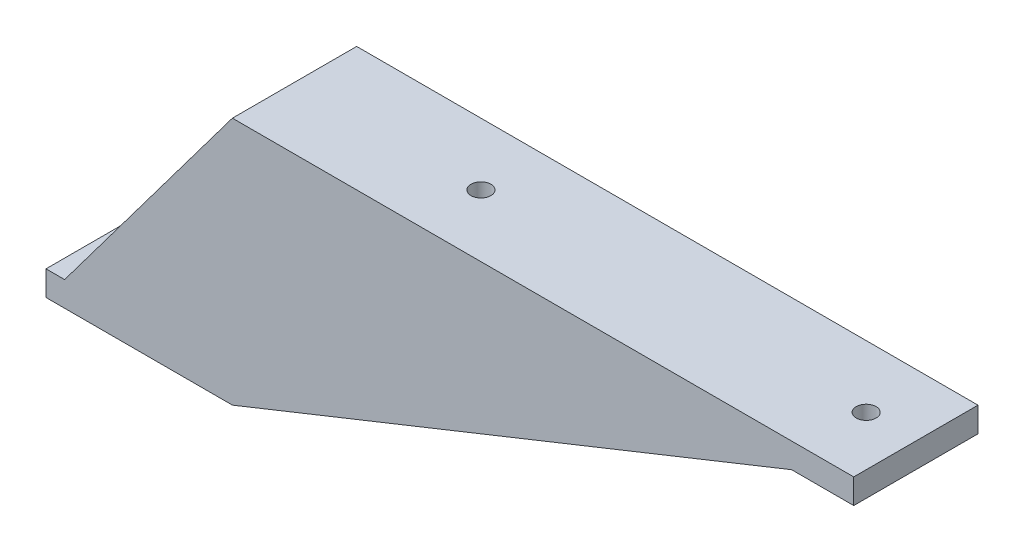
ISO-10303-21;
HEADER;
FILE_DESCRIPTION(('STEP AP214'),'2;1');
FILE_NAME('part.step','',(''),(''),'','','');
FILE_SCHEMA(('AUTOMOTIVE_DESIGN { 1 0 10303 214 1 1 1 1 }'));
ENDSEC;
DATA;
#1=APPLICATION_CONTEXT('core data for automotive mechanical design processes');
#2=APPLICATION_PROTOCOL_DEFINITION('international standard','automotive_design',2000,#1);
#3=PRODUCT_CONTEXT('',#1,'mechanical');
#4=PRODUCT('Part','Part','',(#3));
#5=PRODUCT_RELATED_PRODUCT_CATEGORY('part','',(#4));
#6=PRODUCT_DEFINITION_FORMATION('','',#4);
#7=PRODUCT_DEFINITION_CONTEXT('part definition',#1,'design');
#8=PRODUCT_DEFINITION('design','',#6,#7);
#9=PRODUCT_DEFINITION_SHAPE('','',#8);
#10=(LENGTH_UNIT() NAMED_UNIT(*) SI_UNIT(.MILLI.,.METRE.));
#11=(NAMED_UNIT(*) PLANE_ANGLE_UNIT() SI_UNIT($,.RADIAN.));
#12=(NAMED_UNIT(*) SI_UNIT($,.STERADIAN.) SOLID_ANGLE_UNIT());
#13=UNCERTAINTY_MEASURE_WITH_UNIT(LENGTH_MEASURE(1.E-05),#10,'distance_accuracy_value','');
#14=(GEOMETRIC_REPRESENTATION_CONTEXT(3) GLOBAL_UNCERTAINTY_ASSIGNED_CONTEXT((#13)) GLOBAL_UNIT_ASSIGNED_CONTEXT((#10,
#11,#12)) REPRESENTATION_CONTEXT('',''));
#15=CARTESIAN_POINT('',(0.,0.,0.));
#16=DIRECTION('',(0.,0.,1.));
#17=DIRECTION('',(1.,0.,0.));
#18=AXIS2_PLACEMENT_3D('',#15,#16,#17);
#19=CARTESIAN_POINT('',(0.,0.,0.));
#20=DIRECTION('',(0.,0.,-1.));
#21=DIRECTION('',(-1.,0.,0.));
#22=AXIS2_PLACEMENT_3D('',#19,#20,#21);
#23=PLANE('',#22);
#24=DIRECTION('',(0.928476690885259,0.371390676354104,0.));
#25=VECTOR('',#24,1.);
#26=CARTESIAN_POINT('',(50.,20.,0.));
#27=LINE('',#26,#25);
#28=CARTESIAN_POINT('',(1.,0.399999999999999,0.));
#29=VERTEX_POINT('',#28);
#30=CARTESIAN_POINT('',(45.,18.,0.));
#31=VERTEX_POINT('',#30);
#32=EDGE_CURVE('E207',#29,#31,#27,.T.);
#33=ORIENTED_EDGE('',*,*,#32,.F.);
#34=DIRECTION('',(0.,-1.,0.));
#35=VECTOR('',#34,1.);
#36=CARTESIAN_POINT('',(1.,18.,0.));
#37=LINE('',#36,#35);
#38=CARTESIAN_POINT('',(1.,18.,0.));
#39=VERTEX_POINT('',#38);
#40=EDGE_CURVE('E226',#39,#29,#37,.T.);
#41=ORIENTED_EDGE('',*,*,#40,.F.);
#42=DIRECTION('',(1.,0.,0.));
#43=VECTOR('',#42,1.);
#44=CARTESIAN_POINT('',(0.,18.,0.));
#45=LINE('',#44,#43);
#46=EDGE_CURVE('E43',#39,#31,#45,.T.);
#47=ORIENTED_EDGE('',*,*,#46,.T.);
#48=EDGE_LOOP('',(#33,#41,#47));
#49=FACE_BOUND('',#48,.T.);
#50=ADVANCED_FACE('F35',(#49),#23,.T.);
#51=DIRECTION('',(-0.6,-0.8,0.));
#52=VECTOR('',#51,1.);
#53=CARTESIAN_POINT('',(-15.,0.,0.));
#54=LINE('',#53,#52);
#55=CARTESIAN_POINT('',(-0.999999999999991,18.6666666666667,0.));
#56=VERTEX_POINT('',#55);
#57=CARTESIAN_POINT('',(-13.5,2.,0.));
#58=VERTEX_POINT('',#57);
#59=EDGE_CURVE('E210',#56,#58,#54,.T.);
#60=ORIENTED_EDGE('',*,*,#59,.F.);
#61=DIRECTION('',(0.,1.,0.));
#62=VECTOR('',#61,1.);
#63=CARTESIAN_POINT('',(-0.999999999999998,2.,0.));
#64=LINE('',#63,#62);
#65=CARTESIAN_POINT('',(-0.999999999999998,2.,0.));
#66=VERTEX_POINT('',#65);
#67=EDGE_CURVE('E148',#66,#56,#64,.T.);
#68=ORIENTED_EDGE('',*,*,#67,.F.);
#69=DIRECTION('',(-1.,0.,0.));
#70=VECTOR('',#69,1.);
#71=CARTESIAN_POINT('',(0.,2.,0.));
#72=LINE('',#71,#70);
#73=EDGE_CURVE('E11',#66,#58,#72,.T.);
#74=ORIENTED_EDGE('',*,*,#73,.T.);
#75=EDGE_LOOP('',(#60,#68,#74));
#76=FACE_BOUND('',#75,.T.);
#77=ADVANCED_FACE('F332',(#76),#23,.T.);
#78=CARTESIAN_POINT('',(0.,18.,0.));
#79=DIRECTION('',(0.,1.,0.));
#80=DIRECTION('',(0.,0.,1.));
#81=AXIS2_PLACEMENT_3D('',#78,#79,#80);
#82=PLANE('',#81);
#83=CARTESIAN_POINT('',(15.,18.,-3.));
#84=DIRECTION('',(0.,1.,0.));
#85=DIRECTION('',(0.,0.,1.));
#86=AXIS2_PLACEMENT_3D('',#83,#84,#85);
#87=CIRCLE('',#86,0.799999999999999);
#88=CARTESIAN_POINT('',(15.,18.,-2.2));
#89=VERTEX_POINT('',#88);
#90=EDGE_CURVE('E287',#89,#89,#87,.T.);
#91=ORIENTED_EDGE('',*,*,#90,.T.);
#92=EDGE_LOOP('',(#91));
#93=FACE_BOUND('',#92,.T.);
#94=CARTESIAN_POINT('',(46.,18.,-3.));
#95=DIRECTION('',(0.,1.,0.));
#96=DIRECTION('',(0.,0.,1.));
#97=AXIS2_PLACEMENT_3D('',#94,#95,#96);
#98=CIRCLE('',#97,0.800000000000003);
#99=CARTESIAN_POINT('',(46.,18.,-2.2));
#100=VERTEX_POINT('',#99);
#101=EDGE_CURVE('E279',#100,#100,#98,.T.);
#102=ORIENTED_EDGE('',*,*,#101,.T.);
#103=EDGE_LOOP('',(#102));
#104=FACE_BOUND('',#103,.T.);
#105=DIRECTION('',(0.,0.,1.));
#106=VECTOR('',#105,1.);
#107=CARTESIAN_POINT('',(1.,18.,-6.));
#108=LINE('',#107,#106);
#109=CARTESIAN_POINT('',(1.,18.,-6.));
#110=VERTEX_POINT('',#109);
#111=EDGE_CURVE('E139',#110,#39,#108,.T.);
#112=ORIENTED_EDGE('',*,*,#111,.F.);
#113=DIRECTION('',(1.,0.,0.));
#114=VECTOR('',#113,1.);
#115=CARTESIAN_POINT('',(0.,18.,-5.99999999999999));
#116=LINE('',#115,#114);
#117=CARTESIAN_POINT('',(45.,18.,-6.));
#118=VERTEX_POINT('',#117);
#119=EDGE_CURVE('E154',#110,#118,#116,.T.);
#120=ORIENTED_EDGE('',*,*,#119,.T.);
#121=DIRECTION('',(0.,0.,-1.));
#122=VECTOR('',#121,1.);
#123=CARTESIAN_POINT('',(45.,18.,0.));
#124=LINE('',#123,#122);
#125=CARTESIAN_POINT('',(45.,18.,-8.));
#126=VERTEX_POINT('',#125);
#127=EDGE_CURVE('E162',#118,#126,#124,.T.);
#128=ORIENTED_EDGE('',*,*,#127,.T.);
#129=DIRECTION('',(-1.,0.,0.));
#130=VECTOR('',#129,1.);
#131=CARTESIAN_POINT('',(50.,18.,-8.));
#132=LINE('',#131,#130);
#133=CARTESIAN_POINT('',(50.,18.,-8.));
#134=VERTEX_POINT('',#133);
#135=EDGE_CURVE('E193',#134,#126,#132,.T.);
#136=ORIENTED_EDGE('',*,*,#135,.F.);
#137=DIRECTION('',(0.,0.,-1.));
#138=VECTOR('',#137,1.);
#139=CARTESIAN_POINT('',(50.,18.,2.));
#140=LINE('',#139,#138);
#141=CARTESIAN_POINT('',(50.,18.,2.));
#142=VERTEX_POINT('',#141);
#143=EDGE_CURVE('E190',#142,#134,#140,.T.);
#144=ORIENTED_EDGE('',*,*,#143,.F.);
#145=DIRECTION('',(1.,0.,0.));
#146=VECTOR('',#145,1.);
#147=CARTESIAN_POINT('',(50.,18.,2.));
#148=LINE('',#147,#146);
#149=CARTESIAN_POINT('',(45.,18.,2.));
#150=VERTEX_POINT('',#149);
#151=EDGE_CURVE('E196',#150,#142,#148,.T.);
#152=ORIENTED_EDGE('',*,*,#151,.F.);
#153=DIRECTION('',(0.,0.,-1.));
#154=VECTOR('',#153,1.);
#155=CARTESIAN_POINT('',(45.,18.,2.));
#156=LINE('',#155,#154);
#157=EDGE_CURVE('E203',#150,#31,#156,.T.);
#158=ORIENTED_EDGE('',*,*,#157,.T.);
#159=ORIENTED_EDGE('',*,*,#46,.F.);
#160=EDGE_LOOP('',(#112,#120,#128,#136,#144,#152,#158,#159));
#161=FACE_BOUND('',#160,.T.);
#162=ADVANCED_FACE('F152',(#93,#104,#161),#82,.F.);
#163=CARTESIAN_POINT('',(0.,2.,0.));
#164=DIRECTION('',(0.,-1.,0.));
#165=DIRECTION('',(1.,0.,0.));
#166=AXIS2_PLACEMENT_3D('',#163,#164,#165);
#167=PLANE('',#166);
#168=CARTESIAN_POINT('',(-5.,2.,-3.));
#169=DIRECTION('',(0.,-1.,0.));
#170=DIRECTION('',(1.,0.,0.));
#171=AXIS2_PLACEMENT_3D('',#168,#169,#170);
#172=CIRCLE('',#171,0.800000000000001);
#173=CARTESIAN_POINT('',(-4.2,2.,-3.));
#174=VERTEX_POINT('',#173);
#175=EDGE_CURVE('E299',#174,#174,#172,.T.);
#176=ORIENTED_EDGE('',*,*,#175,.T.);
#177=EDGE_LOOP('',(#176));
#178=FACE_BOUND('',#177,.T.);
#179=CARTESIAN_POINT('',(-11.,2.,-3.));
#180=DIRECTION('',(0.,-1.,0.));
#181=DIRECTION('',(1.,0.,0.));
#182=AXIS2_PLACEMENT_3D('',#179,#180,#181);
#183=CIRCLE('',#182,0.800000000000001);
#184=CARTESIAN_POINT('',(-10.2,2.,-3.));
#185=VERTEX_POINT('',#184);
#186=EDGE_CURVE('E293',#185,#185,#183,.T.);
#187=ORIENTED_EDGE('',*,*,#186,.T.);
#188=EDGE_LOOP('',(#187));
#189=FACE_BOUND('',#188,.T.);
#190=DIRECTION('',(0.,0.,1.));
#191=VECTOR('',#190,1.);
#192=CARTESIAN_POINT('',(-0.999999999999998,2.,-6.));
#193=LINE('',#192,#191);
#194=CARTESIAN_POINT('',(-0.999999999999998,2.,-6.));
#195=VERTEX_POINT('',#194);
#196=EDGE_CURVE('E273',#195,#66,#193,.T.);
#197=ORIENTED_EDGE('',*,*,#196,.F.);
#198=DIRECTION('',(-1.,0.,0.));
#199=VECTOR('',#198,1.);
#200=CARTESIAN_POINT('',(0.,2.,-5.99999999999999));
#201=LINE('',#200,#199);
#202=CARTESIAN_POINT('',(-13.5,2.,-5.99999999999999));
#203=VERTEX_POINT('',#202);
#204=EDGE_CURVE('E163',#195,#203,#201,.T.);
#205=ORIENTED_EDGE('',*,*,#204,.T.);
#206=DIRECTION('',(0.,0.,-1.));
#207=VECTOR('',#206,1.);
#208=CARTESIAN_POINT('',(-13.5,2.,0.));
#209=LINE('',#208,#207);
#210=CARTESIAN_POINT('',(-13.5,2.,-7.99999999999999));
#211=VERTEX_POINT('',#210);
#212=EDGE_CURVE('E167',#203,#211,#209,.T.);
#213=ORIENTED_EDGE('',*,*,#212,.T.);
#214=DIRECTION('',(1.,0.,0.));
#215=VECTOR('',#214,1.);
#216=CARTESIAN_POINT('',(-15.,2.,-7.99999999999999));
#217=LINE('',#216,#215);
#218=CARTESIAN_POINT('',(-15.,2.,-7.99999999999999));
#219=VERTEX_POINT('',#218);
#220=EDGE_CURVE('E174',#219,#211,#217,.T.);
#221=ORIENTED_EDGE('',*,*,#220,.F.);
#222=DIRECTION('',(0.,0.,-1.));
#223=VECTOR('',#222,1.);
#224=CARTESIAN_POINT('',(-15.,2.,2.));
#225=LINE('',#224,#223);
#226=CARTESIAN_POINT('',(-15.,2.,2.));
#227=VERTEX_POINT('',#226);
#228=EDGE_CURVE('E171',#227,#219,#225,.T.);
#229=ORIENTED_EDGE('',*,*,#228,.F.);
#230=DIRECTION('',(-1.,0.,0.));
#231=VECTOR('',#230,1.);
#232=CARTESIAN_POINT('',(-15.,2.,2.));
#233=LINE('',#232,#231);
#234=CARTESIAN_POINT('',(-13.5,2.,2.));
#235=VERTEX_POINT('',#234);
#236=EDGE_CURVE('E177',#235,#227,#233,.T.);
#237=ORIENTED_EDGE('',*,*,#236,.F.);
#238=DIRECTION('',(0.,0.,-1.));
#239=VECTOR('',#238,1.);
#240=CARTESIAN_POINT('',(-13.5,2.,2.));
#241=LINE('',#240,#239);
#242=EDGE_CURVE('E184',#235,#58,#241,.T.);
#243=ORIENTED_EDGE('',*,*,#242,.T.);
#244=ORIENTED_EDGE('',*,*,#73,.F.);
#245=EDGE_LOOP('',(#197,#205,#213,#221,#229,#237,#243,#244));
#246=FACE_BOUND('',#245,.T.);
#247=ADVANCED_FACE('F258',(#178,#189,#246),#167,.F.);
#248=CARTESIAN_POINT('',(0.,0.,-5.99999999999999));
#249=DIRECTION('',(0.,0.,1.));
#250=DIRECTION('',(1.,0.,0.));
#251=AXIS2_PLACEMENT_3D('',#248,#249,#250);
#252=PLANE('',#251);
#253=ORIENTED_EDGE('',*,*,#119,.F.);
#254=DIRECTION('',(0.,-1.,0.));
#255=VECTOR('',#254,1.);
#256=CARTESIAN_POINT('',(1.,18.,-6.));
#257=LINE('',#256,#255);
#258=CARTESIAN_POINT('',(1.,0.399999999999999,-6.));
#259=VERTEX_POINT('',#258);
#260=EDGE_CURVE('E136',#110,#259,#257,.T.);
#261=ORIENTED_EDGE('',*,*,#260,.T.);
#262=DIRECTION('',(-0.928476690885259,-0.371390676354104,0.));
#263=VECTOR('',#262,1.);
#264=CARTESIAN_POINT('',(50.,20.,-6.));
#265=LINE('',#264,#263);
#266=EDGE_CURVE('E161',#118,#259,#265,.T.);
#267=ORIENTED_EDGE('',*,*,#266,.F.);
#268=EDGE_LOOP('',(#253,#261,#267));
#269=FACE_BOUND('',#268,.T.);
#270=ADVANCED_FACE('F160',(#269),#252,.T.);
#271=ORIENTED_EDGE('',*,*,#204,.F.);
#272=DIRECTION('',(0.,1.,0.));
#273=VECTOR('',#272,1.);
#274=CARTESIAN_POINT('',(-0.999999999999998,2.,-6.));
#275=LINE('',#274,#273);
#276=CARTESIAN_POINT('',(-0.999999999999991,18.6666666666667,-6.));
#277=VERTEX_POINT('',#276);
#278=EDGE_CURVE('E147',#195,#277,#275,.T.);
#279=ORIENTED_EDGE('',*,*,#278,.T.);
#280=DIRECTION('',(0.6,0.8,0.));
#281=VECTOR('',#280,1.);
#282=CARTESIAN_POINT('',(-15.,0.,-5.99999999999999));
#283=LINE('',#282,#281);
#284=EDGE_CURVE('E266',#203,#277,#283,.T.);
#285=ORIENTED_EDGE('',*,*,#284,.F.);
#286=EDGE_LOOP('',(#271,#279,#285));
#287=FACE_BOUND('',#286,.T.);
#288=ADVANCED_FACE('F344',(#287),#252,.T.);
#289=CARTESIAN_POINT('',(-15.,0.,2.));
#290=DIRECTION('',(0.8,-0.6,0.));
#291=DIRECTION('',(0.6,0.8,0.));
#292=AXIS2_PLACEMENT_3D('',#289,#290,#291);
#293=PLANE('',#292);
#294=ORIENTED_EDGE('',*,*,#242,.F.);
#295=DIRECTION('',(-0.6,-0.8,0.));
#296=VECTOR('',#295,1.);
#297=CARTESIAN_POINT('',(-15.,0.,2.));
#298=LINE('',#297,#296);
#299=CARTESIAN_POINT('',(0.,20.,2.));
#300=VERTEX_POINT('',#299);
#301=EDGE_CURVE('E212',#300,#235,#298,.T.);
#302=ORIENTED_EDGE('',*,*,#301,.F.);
#303=DIRECTION('',(0.,0.,-1.));
#304=VECTOR('',#303,1.);
#305=CARTESIAN_POINT('',(0.,20.,2.));
#306=LINE('',#305,#304);
#307=CARTESIAN_POINT('',(0.,20.,-7.99999999999999));
#308=VERTEX_POINT('',#307);
#309=EDGE_CURVE('E221',#300,#308,#306,.T.);
#310=ORIENTED_EDGE('',*,*,#309,.T.);
#311=DIRECTION('',(0.6,0.8,0.));
#312=VECTOR('',#311,1.);
#313=CARTESIAN_POINT('',(-15.,0.,-7.99999999999999));
#314=LINE('',#313,#312);
#315=EDGE_CURVE('E243',#211,#308,#314,.T.);
#316=ORIENTED_EDGE('',*,*,#315,.F.);
#317=ORIENTED_EDGE('',*,*,#212,.F.);
#318=ORIENTED_EDGE('',*,*,#284,.T.);
#319=DIRECTION('',(0.,0.,1.));
#320=VECTOR('',#319,1.);
#321=CARTESIAN_POINT('',(-0.999999999999991,18.6666666666667,-6.));
#322=LINE('',#321,#320);
#323=EDGE_CURVE('E275',#277,#56,#322,.T.);
#324=ORIENTED_EDGE('',*,*,#323,.T.);
#325=ORIENTED_EDGE('',*,*,#59,.T.);
#326=EDGE_LOOP('',(#294,#302,#310,#316,#317,#318,#324,#325));
#327=FACE_BOUND('',#326,.T.);
#328=ADVANCED_FACE('F249',(#327),#293,.F.);
#329=CARTESIAN_POINT('',(50.,20.,2.));
#330=DIRECTION('',(-0.371390676354104,0.928476690885259,0.));
#331=DIRECTION('',(-0.928476690885259,-0.371390676354104,0.));
#332=AXIS2_PLACEMENT_3D('',#329,#330,#331);
#333=PLANE('',#332);
#334=ORIENTED_EDGE('',*,*,#157,.F.);
#335=DIRECTION('',(0.928476690885259,0.371390676354104,0.));
#336=VECTOR('',#335,1.);
#337=CARTESIAN_POINT('',(50.,20.,2.));
#338=LINE('',#337,#336);
#339=CARTESIAN_POINT('',(0.,0.,2.));
#340=VERTEX_POINT('',#339);
#341=EDGE_CURVE('E208',#340,#150,#338,.T.);
#342=ORIENTED_EDGE('',*,*,#341,.F.);
#343=DIRECTION('',(0.,0.,-1.));
#344=VECTOR('',#343,1.);
#345=CARTESIAN_POINT('',(0.,0.,2.));
#346=LINE('',#345,#344);
#347=CARTESIAN_POINT('',(0.,0.,-7.99999999999999));
#348=VERTEX_POINT('',#347);
#349=EDGE_CURVE('E215',#340,#348,#346,.T.);
#350=ORIENTED_EDGE('',*,*,#349,.T.);
#351=DIRECTION('',(-0.928476690885259,-0.371390676354104,0.));
#352=VECTOR('',#351,1.);
#353=CARTESIAN_POINT('',(50.,20.,-8.));
#354=LINE('',#353,#352);
#355=EDGE_CURVE('E158',#126,#348,#354,.T.);
#356=ORIENTED_EDGE('',*,*,#355,.F.);
#357=ORIENTED_EDGE('',*,*,#127,.F.);
#358=ORIENTED_EDGE('',*,*,#266,.T.);
#359=DIRECTION('',(0.,0.,1.));
#360=VECTOR('',#359,1.);
#361=CARTESIAN_POINT('',(1.,0.399999999999999,-6.));
#362=LINE('',#361,#360);
#363=EDGE_CURVE('E142',#259,#29,#362,.T.);
#364=ORIENTED_EDGE('',*,*,#363,.T.);
#365=ORIENTED_EDGE('',*,*,#32,.T.);
#366=EDGE_LOOP('',(#334,#342,#350,#356,#357,#358,#364,#365));
#367=FACE_BOUND('',#366,.T.);
#368=ADVANCED_FACE('F37',(#367),#333,.F.);
#369=CARTESIAN_POINT('',(0.,20.,2.));
#370=DIRECTION('',(0.,-1.,0.));
#371=DIRECTION('',(0.,0.,-1.));
#372=AXIS2_PLACEMENT_3D('',#369,#370,#371);
#373=PLANE('',#372);
#374=CARTESIAN_POINT('',(15.,20.,-3.));
#375=DIRECTION('',(0.,1.,0.));
#376=DIRECTION('',(0.,0.,1.));
#377=AXIS2_PLACEMENT_3D('',#374,#375,#376);
#378=CIRCLE('',#377,0.799999999999999);
#379=CARTESIAN_POINT('',(15.,20.,-2.2));
#380=VERTEX_POINT('',#379);
#381=EDGE_CURVE('E290',#380,#380,#378,.T.);
#382=ORIENTED_EDGE('',*,*,#381,.F.);
#383=EDGE_LOOP('',(#382));
#384=FACE_BOUND('',#383,.T.);
#385=CARTESIAN_POINT('',(46.,20.,-3.));
#386=DIRECTION('',(0.,1.,0.));
#387=DIRECTION('',(0.,0.,1.));
#388=AXIS2_PLACEMENT_3D('',#385,#386,#387);
#389=CIRCLE('',#388,0.800000000000003);
#390=CARTESIAN_POINT('',(46.,20.,-2.2));
#391=VERTEX_POINT('',#390);
#392=EDGE_CURVE('E284',#391,#391,#389,.T.);
#393=ORIENTED_EDGE('',*,*,#392,.F.);
#394=EDGE_LOOP('',(#393));
#395=FACE_BOUND('',#394,.T.);
#396=DIRECTION('',(0.,0.,-1.));
#397=VECTOR('',#396,1.);
#398=CARTESIAN_POINT('',(50.,20.,2.));
#399=LINE('',#398,#397);
#400=CARTESIAN_POINT('',(50.,20.,2.));
#401=VERTEX_POINT('',#400);
#402=CARTESIAN_POINT('',(50.,20.,-8.));
#403=VERTEX_POINT('',#402);
#404=EDGE_CURVE('E223',#401,#403,#399,.T.);
#405=ORIENTED_EDGE('',*,*,#404,.T.);
#406=DIRECTION('',(-1.,0.,0.));
#407=VECTOR('',#406,1.);
#408=CARTESIAN_POINT('',(50.,20.,-8.));
#409=LINE('',#408,#407);
#410=EDGE_CURVE('E189',#403,#308,#409,.T.);
#411=ORIENTED_EDGE('',*,*,#410,.T.);
#412=ORIENTED_EDGE('',*,*,#309,.F.);
#413=DIRECTION('',(-1.,0.,0.));
#414=VECTOR('',#413,1.);
#415=CARTESIAN_POINT('',(0.,20.,2.));
#416=LINE('',#415,#414);
#417=EDGE_CURVE('E57',#401,#300,#416,.T.);
#418=ORIENTED_EDGE('',*,*,#417,.F.);
#419=EDGE_LOOP('',(#405,#411,#412,#418));
#420=FACE_BOUND('',#419,.T.);
#421=ADVANCED_FACE('F245',(#384,#395,#420),#373,.F.);
#422=CARTESIAN_POINT('',(0.,0.,2.));
#423=DIRECTION('',(0.,1.,0.));
#424=DIRECTION('',(-1.,0.,0.));
#425=AXIS2_PLACEMENT_3D('',#422,#423,#424);
#426=PLANE('',#425);
#427=CARTESIAN_POINT('',(-5.,0.,-3.));
#428=DIRECTION('',(0.,1.,0.));
#429=DIRECTION('',(0.,0.,1.));
#430=AXIS2_PLACEMENT_3D('',#427,#428,#429);
#431=CIRCLE('',#430,0.800000000000001);
#432=CARTESIAN_POINT('',(-5.,0.,-2.2));
#433=VERTEX_POINT('',#432);
#434=EDGE_CURVE('E302',#433,#433,#431,.T.);
#435=ORIENTED_EDGE('',*,*,#434,.T.);
#436=EDGE_LOOP('',(#435));
#437=FACE_BOUND('',#436,.T.);
#438=CARTESIAN_POINT('',(-11.,0.,-3.));
#439=DIRECTION('',(0.,1.,0.));
#440=DIRECTION('',(0.,0.,1.));
#441=AXIS2_PLACEMENT_3D('',#438,#439,#440);
#442=CIRCLE('',#441,0.800000000000001);
#443=CARTESIAN_POINT('',(-11.,0.,-2.2));
#444=VERTEX_POINT('',#443);
#445=EDGE_CURVE('E296',#444,#444,#442,.T.);
#446=ORIENTED_EDGE('',*,*,#445,.T.);
#447=EDGE_LOOP('',(#446));
#448=FACE_BOUND('',#447,.T.);
#449=DIRECTION('',(0.,0.,-1.));
#450=VECTOR('',#449,1.);
#451=CARTESIAN_POINT('',(-15.,0.,2.));
#452=LINE('',#451,#450);
#453=CARTESIAN_POINT('',(-15.,0.,2.));
#454=VERTEX_POINT('',#453);
#455=CARTESIAN_POINT('',(-15.,0.,-7.99999999999999));
#456=VERTEX_POINT('',#455);
#457=EDGE_CURVE('E219',#454,#456,#452,.T.);
#458=ORIENTED_EDGE('',*,*,#457,.T.);
#459=DIRECTION('',(1.,0.,0.));
#460=VECTOR('',#459,1.);
#461=CARTESIAN_POINT('',(-15.,0.,-7.99999999999999));
#462=LINE('',#461,#460);
#463=EDGE_CURVE('E165',#456,#348,#462,.T.);
#464=ORIENTED_EDGE('',*,*,#463,.T.);
#465=ORIENTED_EDGE('',*,*,#349,.F.);
#466=DIRECTION('',(1.,0.,0.));
#467=VECTOR('',#466,1.);
#468=CARTESIAN_POINT('',(0.,0.,2.));
#469=LINE('',#468,#467);
#470=EDGE_CURVE('E50',#454,#340,#469,.T.);
#471=ORIENTED_EDGE('',*,*,#470,.F.);
#472=EDGE_LOOP('',(#458,#464,#465,#471));
#473=FACE_BOUND('',#472,.T.);
#474=ADVANCED_FACE('F262',(#437,#448,#473),#426,.F.);
#475=CARTESIAN_POINT('',(0.,0.,2.));
#476=DIRECTION('',(0.,0.,-1.));
#477=DIRECTION('',(-1.,0.,0.));
#478=AXIS2_PLACEMENT_3D('',#475,#476,#477);
#479=PLANE('',#478);
#480=ORIENTED_EDGE('',*,*,#470,.T.);
#481=ORIENTED_EDGE('',*,*,#341,.T.);
#482=ORIENTED_EDGE('',*,*,#151,.T.);
#483=DIRECTION('',(0.,1.,0.));
#484=VECTOR('',#483,1.);
#485=CARTESIAN_POINT('',(50.,18.,2.));
#486=LINE('',#485,#484);
#487=EDGE_CURVE('E201',#142,#401,#486,.T.);
#488=ORIENTED_EDGE('',*,*,#487,.T.);
#489=ORIENTED_EDGE('',*,*,#417,.T.);
#490=ORIENTED_EDGE('',*,*,#301,.T.);
#491=ORIENTED_EDGE('',*,*,#236,.T.);
#492=DIRECTION('',(0.,-1.,0.));
#493=VECTOR('',#492,1.);
#494=CARTESIAN_POINT('',(-15.,2.,2.));
#495=LINE('',#494,#493);
#496=EDGE_CURVE('E182',#227,#454,#495,.T.);
#497=ORIENTED_EDGE('',*,*,#496,.T.);
#498=EDGE_LOOP('',(#480,#481,#482,#488,#489,#490,#491,#497));
#499=FACE_BOUND('',#498,.T.);
#500=ADVANCED_FACE('F231',(#499),#479,.F.);
#501=CARTESIAN_POINT('',(50.,18.,2.));
#502=DIRECTION('',(1.,0.,0.));
#503=DIRECTION('',(0.,0.,-1.));
#504=AXIS2_PLACEMENT_3D('',#501,#502,#503);
#505=PLANE('',#504);
#506=ORIENTED_EDGE('',*,*,#404,.F.);
#507=ORIENTED_EDGE('',*,*,#487,.F.);
#508=ORIENTED_EDGE('',*,*,#143,.T.);
#509=DIRECTION('',(0.,1.,0.));
#510=VECTOR('',#509,1.);
#511=CARTESIAN_POINT('',(50.,18.,-8.));
#512=LINE('',#511,#510);
#513=EDGE_CURVE('E198',#134,#403,#512,.T.);
#514=ORIENTED_EDGE('',*,*,#513,.T.);
#515=EDGE_LOOP('',(#506,#507,#508,#514));
#516=FACE_BOUND('',#515,.T.);
#517=ADVANCED_FACE('F235',(#516),#505,.T.);
#518=CARTESIAN_POINT('',(50.,18.,-8.));
#519=DIRECTION('',(0.,0.,-1.));
#520=DIRECTION('',(-1.,0.,0.));
#521=AXIS2_PLACEMENT_3D('',#518,#519,#520);
#522=PLANE('',#521);
#523=ORIENTED_EDGE('',*,*,#135,.T.);
#524=ORIENTED_EDGE('',*,*,#355,.T.);
#525=ORIENTED_EDGE('',*,*,#463,.F.);
#526=DIRECTION('',(0.,-1.,0.));
#527=VECTOR('',#526,1.);
#528=CARTESIAN_POINT('',(-15.,2.,-7.99999999999999));
#529=LINE('',#528,#527);
#530=EDGE_CURVE('E179',#219,#456,#529,.T.);
#531=ORIENTED_EDGE('',*,*,#530,.F.);
#532=ORIENTED_EDGE('',*,*,#220,.T.);
#533=ORIENTED_EDGE('',*,*,#315,.T.);
#534=ORIENTED_EDGE('',*,*,#410,.F.);
#535=ORIENTED_EDGE('',*,*,#513,.F.);
#536=EDGE_LOOP('',(#523,#524,#525,#531,#532,#533,#534,#535));
#537=FACE_BOUND('',#536,.T.);
#538=ADVANCED_FACE('F239',(#537),#522,.T.);
#539=CARTESIAN_POINT('',(-15.,2.,2.));
#540=DIRECTION('',(-1.,0.,0.));
#541=DIRECTION('',(0.,-1.,0.));
#542=AXIS2_PLACEMENT_3D('',#539,#540,#541);
#543=PLANE('',#542);
#544=ORIENTED_EDGE('',*,*,#457,.F.);
#545=ORIENTED_EDGE('',*,*,#496,.F.);
#546=ORIENTED_EDGE('',*,*,#228,.T.);
#547=ORIENTED_EDGE('',*,*,#530,.T.);
#548=EDGE_LOOP('',(#544,#545,#546,#547));
#549=FACE_BOUND('',#548,.T.);
#550=ADVANCED_FACE('F255',(#549),#543,.T.);
#551=CARTESIAN_POINT('',(-0.999999999999998,2.,-6.));
#552=DIRECTION('',(1.,0.,0.));
#553=DIRECTION('',(0.,1.,0.));
#554=AXIS2_PLACEMENT_3D('',#551,#552,#553);
#555=PLANE('',#554);
#556=ORIENTED_EDGE('',*,*,#67,.T.);
#557=ORIENTED_EDGE('',*,*,#323,.F.);
#558=ORIENTED_EDGE('',*,*,#278,.F.);
#559=ORIENTED_EDGE('',*,*,#196,.T.);
#560=EDGE_LOOP('',(#556,#557,#558,#559));
#561=FACE_BOUND('',#560,.T.);
#562=ADVANCED_FACE('F413',(#561),#555,.F.);
#563=CARTESIAN_POINT('',(1.,18.,-6.));
#564=DIRECTION('',(-1.,0.,0.));
#565=DIRECTION('',(0.,-1.,0.));
#566=AXIS2_PLACEMENT_3D('',#563,#564,#565);
#567=PLANE('',#566);
#568=ORIENTED_EDGE('',*,*,#40,.T.);
#569=ORIENTED_EDGE('',*,*,#363,.F.);
#570=ORIENTED_EDGE('',*,*,#260,.F.);
#571=ORIENTED_EDGE('',*,*,#111,.T.);
#572=EDGE_LOOP('',(#568,#569,#570,#571));
#573=FACE_BOUND('',#572,.T.);
#574=ADVANCED_FACE('F138',(#573),#567,.F.);
#575=CARTESIAN_POINT('',(46.,0.,-3.));
#576=DIRECTION('',(0.,1.,0.));
#577=DIRECTION('',(0.,0.,1.));
#578=AXIS2_PLACEMENT_3D('',#575,#576,#577);
#579=CYLINDRICAL_SURFACE('',#578,0.800000000000003);
#580=ORIENTED_EDGE('',*,*,#392,.T.);
#581=EDGE_LOOP('',(#580));
#582=FACE_BOUND('',#581,.T.);
#583=ORIENTED_EDGE('',*,*,#101,.F.);
#584=EDGE_LOOP('',(#583));
#585=FACE_BOUND('',#584,.T.);
#586=ADVANCED_FACE('F327',(#582,#585),#579,.F.);
#587=CARTESIAN_POINT('',(15.,0.,-3.));
#588=DIRECTION('',(0.,1.,0.));
#589=DIRECTION('',(0.,0.,1.));
#590=AXIS2_PLACEMENT_3D('',#587,#588,#589);
#591=CYLINDRICAL_SURFACE('',#590,0.799999999999999);
#592=ORIENTED_EDGE('',*,*,#381,.T.);
#593=EDGE_LOOP('',(#592));
#594=FACE_BOUND('',#593,.T.);
#595=ORIENTED_EDGE('',*,*,#90,.F.);
#596=EDGE_LOOP('',(#595));
#597=FACE_BOUND('',#596,.T.);
#598=ADVANCED_FACE('F321',(#594,#597),#591,.F.);
#599=CARTESIAN_POINT('',(-11.,0.,-3.));
#600=DIRECTION('',(0.,1.,0.));
#601=DIRECTION('',(0.,0.,1.));
#602=AXIS2_PLACEMENT_3D('',#599,#600,#601);
#603=CYLINDRICAL_SURFACE('',#602,0.800000000000001);
#604=ORIENTED_EDGE('',*,*,#445,.F.);
#605=EDGE_LOOP('',(#604));
#606=FACE_BOUND('',#605,.T.);
#607=ORIENTED_EDGE('',*,*,#186,.F.);
#608=EDGE_LOOP('',(#607));
#609=FACE_BOUND('',#608,.T.);
#610=ADVANCED_FACE('F311',(#606,#609),#603,.F.);
#611=CARTESIAN_POINT('',(-5.,0.,-3.));
#612=DIRECTION('',(0.,1.,0.));
#613=DIRECTION('',(0.,0.,1.));
#614=AXIS2_PLACEMENT_3D('',#611,#612,#613);
#615=CYLINDRICAL_SURFACE('',#614,0.800000000000001);
#616=ORIENTED_EDGE('',*,*,#434,.F.);
#617=EDGE_LOOP('',(#616));
#618=FACE_BOUND('',#617,.T.);
#619=ORIENTED_EDGE('',*,*,#175,.F.);
#620=EDGE_LOOP('',(#619));
#621=FACE_BOUND('',#620,.T.);
#622=ADVANCED_FACE('F308',(#618,#621),#615,.F.);
#623=CLOSED_SHELL('',(#50,#77,#162,#247,#270,#288,#328,#368,#421,#474,#500,#517,#538,#550,#562,
#574,#586,#598,#610,#622));
#624=MANIFOLD_SOLID_BREP('B2',#623);
#625=ADVANCED_BREP_SHAPE_REPRESENTATION('',(#18,#624),#14);
#626=SHAPE_DEFINITION_REPRESENTATION(#9,#625);
ENDSEC;
END-ISO-10303-21;
